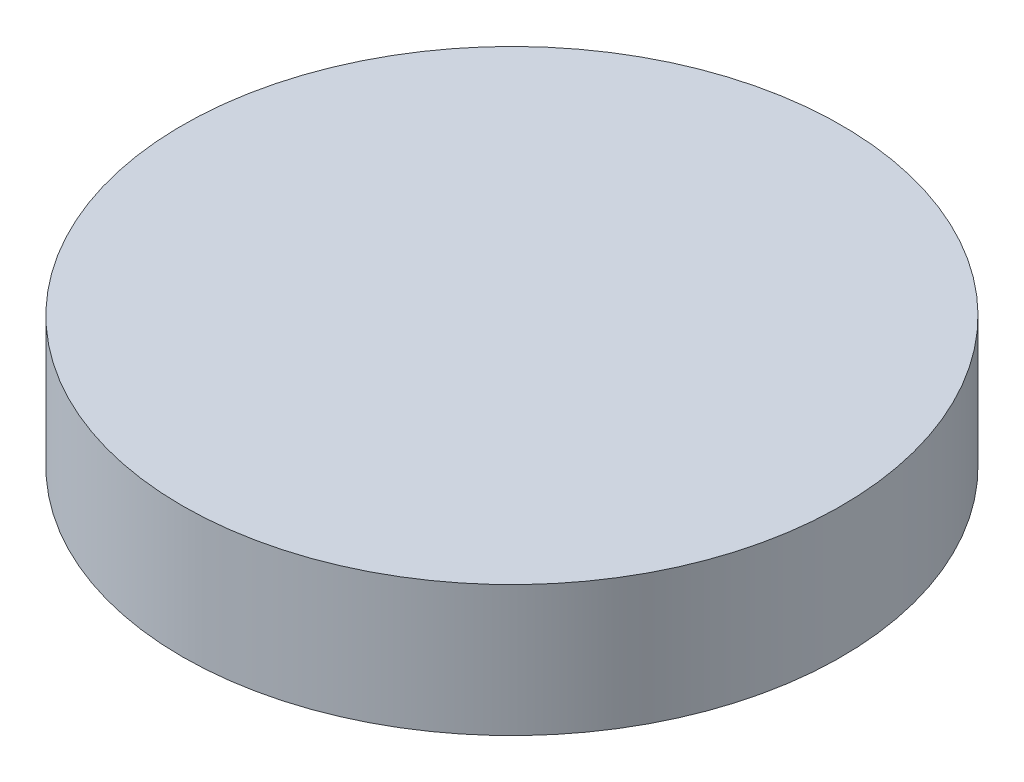
ISO-10303-21;
HEADER;
FILE_DESCRIPTION(('STEP AP214'),'2;1');
FILE_NAME('part.step','',(''),(''),'','','');
FILE_SCHEMA(('AUTOMOTIVE_DESIGN { 1 0 10303 214 1 1 1 1 }'));
ENDSEC;
DATA;
#1=APPLICATION_CONTEXT('core data for automotive mechanical design processes');
#2=APPLICATION_PROTOCOL_DEFINITION('international standard','automotive_design',2000,#1);
#3=PRODUCT_CONTEXT('',#1,'mechanical');
#4=PRODUCT('Part','Part','',(#3));
#5=PRODUCT_RELATED_PRODUCT_CATEGORY('part','',(#4));
#6=PRODUCT_DEFINITION_FORMATION('','',#4);
#7=PRODUCT_DEFINITION_CONTEXT('part definition',#1,'design');
#8=PRODUCT_DEFINITION('design','',#6,#7);
#9=PRODUCT_DEFINITION_SHAPE('','',#8);
#10=(LENGTH_UNIT() NAMED_UNIT(*) SI_UNIT(.MILLI.,.METRE.));
#11=(NAMED_UNIT(*) PLANE_ANGLE_UNIT() SI_UNIT($,.RADIAN.));
#12=(NAMED_UNIT(*) SI_UNIT($,.STERADIAN.) SOLID_ANGLE_UNIT());
#13=UNCERTAINTY_MEASURE_WITH_UNIT(LENGTH_MEASURE(1.E-05),#10,'distance_accuracy_value','');
#14=(GEOMETRIC_REPRESENTATION_CONTEXT(3) GLOBAL_UNCERTAINTY_ASSIGNED_CONTEXT((#13)) GLOBAL_UNIT_ASSIGNED_CONTEXT((#10,
#11,#12)) REPRESENTATION_CONTEXT('',''));
#15=CARTESIAN_POINT('',(0.,0.,0.));
#16=DIRECTION('',(0.,0.,1.));
#17=DIRECTION('',(1.,0.,0.));
#18=AXIS2_PLACEMENT_3D('',#15,#16,#17);
#19=CARTESIAN_POINT('',(0.,20.,0.));
#20=DIRECTION('',(0.,-1.,0.));
#21=DIRECTION('',(0.,0.,-1.));
#22=AXIS2_PLACEMENT_3D('',#19,#20,#21);
#23=CYLINDRICAL_SURFACE('',#22,60.);
#24=DIRECTION('',(0.,-1.,0.));
#25=VECTOR('',#24,1.);
#26=CARTESIAN_POINT('',(-24.473051543471,20.,54.7820203000091));
#27=LINE('',#26,#25);
#28=CARTESIAN_POINT('',(-24.473051543471,0.,54.7820203000091));
#29=VERTEX_POINT('',#28);
#30=CARTESIAN_POINT('',(-24.473051543471,20.,54.7820203000091));
#31=VERTEX_POINT('',#30);
#32=EDGE_CURVE('E495',#29,#31,#27,.F.);
#33=ORIENTED_EDGE('',*,*,#32,.F.);
#34=CARTESIAN_POINT('',(0.,0.,0.));
#35=DIRECTION('',(0.,-1.,0.));
#36=DIRECTION('',(0.,0.,-1.));
#37=AXIS2_PLACEMENT_3D('',#34,#35,#36);
#38=CIRCLE('',#37,60.);
#39=CARTESIAN_POINT('',(-54.4892769106156,0.,25.1180951060836));
#40=VERTEX_POINT('',#39);
#41=EDGE_CURVE('E530',#29,#40,#38,.T.);
#42=ORIENTED_EDGE('',*,*,#41,.T.);
#43=DIRECTION('',(0.,-1.,0.));
#44=VECTOR('',#43,1.);
#45=CARTESIAN_POINT('',(-54.4892769106155,20.,25.1180951060836));
#46=LINE('',#45,#44);
#47=CARTESIAN_POINT('',(-54.4892769106156,20.,25.1180951060836));
#48=VERTEX_POINT('',#47);
#49=EDGE_CURVE('E444',#48,#40,#46,.T.);
#50=ORIENTED_EDGE('',*,*,#49,.F.);
#51=CARTESIAN_POINT('',(0.,20.,0.));
#52=DIRECTION('',(0.,-1.,0.));
#53=DIRECTION('',(0.,0.,-1.));
#54=AXIS2_PLACEMENT_3D('',#51,#52,#53);
#55=CIRCLE('',#54,60.);
#56=EDGE_CURVE('E630',#31,#48,#55,.T.);
#57=ORIENTED_EDGE('',*,*,#56,.F.);
#58=EDGE_LOOP('',(#33,#42,#50,#57));
#59=FACE_BOUND('',#58,.T.);
#60=ADVANCED_FACE('F177',(#59),#23,.F.);
#61=DIRECTION('',(0.,-1.,0.));
#62=VECTOR('',#61,1.);
#63=CARTESIAN_POINT('',(20.7685618254475,20.,-56.2909125854482));
#64=LINE('',#63,#62);
#65=CARTESIAN_POINT('',(20.7685618254475,20.,-56.2909125854481));
#66=VERTEX_POINT('',#65);
#67=CARTESIAN_POINT('',(20.7685618254475,0.,-56.2909125854481));
#68=VERTEX_POINT('',#67);
#69=EDGE_CURVE('E484',#66,#68,#64,.T.);
#70=ORIENTED_EDGE('',*,*,#69,.F.);
#71=CARTESIAN_POINT('',(-23.2878275000444,20.,-55.2962665134652));
#72=VERTEX_POINT('',#71);
#73=EDGE_CURVE('E505',#72,#66,#55,.T.);
#74=ORIENTED_EDGE('',*,*,#73,.F.);
#75=DIRECTION('',(0.,-1.,0.));
#76=VECTOR('',#75,1.);
#77=CARTESIAN_POINT('',(-23.2878275000444,20.,-55.2962665134652));
#78=LINE('',#77,#76);
#79=CARTESIAN_POINT('',(-23.2878275000444,0.,-55.2962665134652));
#80=VERTEX_POINT('',#79);
#81=EDGE_CURVE('E192',#72,#80,#78,.T.);
#82=ORIENTED_EDGE('',*,*,#81,.T.);
#83=EDGE_CURVE('E511',#80,#68,#38,.T.);
#84=ORIENTED_EDGE('',*,*,#83,.T.);
#85=EDGE_LOOP('',(#70,#74,#82,#84));
#86=FACE_BOUND('',#85,.T.);
#87=ADVANCED_FACE('F591',(#86),#23,.F.);
#88=DIRECTION('',(0.,-1.,0.));
#89=VECTOR('',#88,1.);
#90=CARTESIAN_POINT('',(56.0417987439518,20.,-21.4316773385193));
#91=LINE('',#90,#89);
#92=CARTESIAN_POINT('',(56.0417987439518,0.,-21.4316773385193));
#93=VERTEX_POINT('',#92);
#94=CARTESIAN_POINT('',(56.0417987439518,20.,-21.4316773385193));
#95=VERTEX_POINT('',#94);
#96=EDGE_CURVE('E474',#93,#95,#91,.F.);
#97=ORIENTED_EDGE('',*,*,#96,.F.);
#98=CARTESIAN_POINT('',(55.5673457703538,0.,22.633384281586));
#99=VERTEX_POINT('',#98);
#100=EDGE_CURVE('E517',#93,#99,#38,.T.);
#101=ORIENTED_EDGE('',*,*,#100,.T.);
#102=DIRECTION('',(0.,-1.,0.));
#103=VECTOR('',#102,1.);
#104=CARTESIAN_POINT('',(55.5673457703538,20.,22.633384281586));
#105=LINE('',#104,#103);
#106=CARTESIAN_POINT('',(55.5673457703538,20.,22.6333842815859));
#107=VERTEX_POINT('',#106);
#108=EDGE_CURVE('E470',#99,#107,#105,.F.);
#109=ORIENTED_EDGE('',*,*,#108,.T.);
#110=EDGE_CURVE('E642',#95,#107,#55,.T.);
#111=ORIENTED_EDGE('',*,*,#110,.F.);
#112=EDGE_LOOP('',(#97,#101,#109,#111));
#113=FACE_BOUND('',#112,.T.);
#114=ADVANCED_FACE('F671',(#113),#23,.F.);
#115=DIRECTION('',(0.,-1.,0.));
#116=VECTOR('',#115,1.);
#117=CARTESIAN_POINT('',(54.7820203000091,20.,24.4730515434711));
#118=LINE('',#117,#116);
#119=CARTESIAN_POINT('',(54.7820203000091,0.,24.4730515434711));
#120=VERTEX_POINT('',#119);
#121=CARTESIAN_POINT('',(54.7820203000091,20.,24.4730515434711));
#122=VERTEX_POINT('',#121);
#123=EDGE_CURVE('E465',#120,#122,#118,.F.);
#124=ORIENTED_EDGE('',*,*,#123,.F.);
#125=CARTESIAN_POINT('',(23.2878275000444,0.,55.2962665134652));
#126=VERTEX_POINT('',#125);
#127=EDGE_CURVE('E520',#120,#126,#38,.T.);
#128=ORIENTED_EDGE('',*,*,#127,.T.);
#129=DIRECTION('',(0.,-1.,0.));
#130=VECTOR('',#129,1.);
#131=CARTESIAN_POINT('',(23.2878275000444,20.,55.2962665134652));
#132=LINE('',#131,#130);
#133=CARTESIAN_POINT('',(23.2878275000444,20.,55.2962665134652));
#134=VERTEX_POINT('',#133);
#135=EDGE_CURVE('E460',#126,#134,#132,.F.);
#136=ORIENTED_EDGE('',*,*,#135,.T.);
#137=EDGE_CURVE('E637',#122,#134,#55,.T.);
#138=ORIENTED_EDGE('',*,*,#137,.F.);
#139=EDGE_LOOP('',(#124,#128,#136,#138));
#140=FACE_BOUND('',#139,.T.);
#141=ADVANCED_FACE('F1005',(#140),#23,.F.);
#142=CARTESIAN_POINT('',(21.4316773385193,0.,56.0417987439518));
#143=VERTEX_POINT('',#142);
#144=CARTESIAN_POINT('',(-22.6333842815859,0.,55.5673457703538));
#145=VERTEX_POINT('',#144);
#146=EDGE_CURVE('E525',#143,#145,#38,.T.);
#147=ORIENTED_EDGE('',*,*,#146,.T.);
#148=DIRECTION('',(0.,-1.,0.));
#149=VECTOR('',#148,1.);
#150=CARTESIAN_POINT('',(-22.6333842815859,20.,55.5673457703538));
#151=LINE('',#150,#149);
#152=CARTESIAN_POINT('',(-22.6333842815859,20.,55.5673457703538));
#153=VERTEX_POINT('',#152);
#154=EDGE_CURVE('E489',#145,#153,#151,.F.);
#155=ORIENTED_EDGE('',*,*,#154,.T.);
#156=CARTESIAN_POINT('',(21.4316773385193,20.,56.0417987439518));
#157=VERTEX_POINT('',#156);
#158=EDGE_CURVE('E632',#157,#153,#55,.T.);
#159=ORIENTED_EDGE('',*,*,#158,.F.);
#160=DIRECTION('',(0.,-1.,0.));
#161=VECTOR('',#160,1.);
#162=CARTESIAN_POINT('',(21.4316773385193,20.,56.0417987439518));
#163=LINE('',#162,#161);
#164=EDGE_CURVE('E455',#143,#157,#163,.F.);
#165=ORIENTED_EDGE('',*,*,#164,.F.);
#166=EDGE_LOOP('',(#147,#155,#159,#165));
#167=FACE_BOUND('',#166,.T.);
#168=ADVANCED_FACE('F997',(#167),#23,.F.);
#169=CARTESIAN_POINT('',(22.6333842815859,20.,-55.5673457703538));
#170=VERTEX_POINT('',#169);
#171=CARTESIAN_POINT('',(55.2962665134652,20.,-23.2878275000445));
#172=VERTEX_POINT('',#171);
#173=EDGE_CURVE('E510',#170,#172,#55,.T.);
#174=ORIENTED_EDGE('',*,*,#173,.F.);
#175=DIRECTION('',(0.,-1.,0.));
#176=VECTOR('',#175,1.);
#177=CARTESIAN_POINT('',(22.6333842815859,20.,-55.5673457703538));
#178=LINE('',#177,#176);
#179=CARTESIAN_POINT('',(22.6333842815859,0.,-55.5673457703538));
#180=VERTEX_POINT('',#179);
#181=EDGE_CURVE('E479',#170,#180,#178,.T.);
#182=ORIENTED_EDGE('',*,*,#181,.T.);
#183=CARTESIAN_POINT('',(55.2962665134652,0.,-23.2878275000445));
#184=VERTEX_POINT('',#183);
#185=EDGE_CURVE('E509',#180,#184,#38,.T.);
#186=ORIENTED_EDGE('',*,*,#185,.T.);
#187=DIRECTION('',(0.,-1.,0.));
#188=VECTOR('',#187,1.);
#189=CARTESIAN_POINT('',(55.2962665134652,20.,-23.2878275000445));
#190=LINE('',#189,#188);
#191=EDGE_CURVE('E449',#184,#172,#190,.F.);
#192=ORIENTED_EDGE('',*,*,#191,.T.);
#193=EDGE_LOOP('',(#174,#182,#186,#192));
#194=FACE_BOUND('',#193,.T.);
#195=ADVANCED_FACE('F765',(#194),#23,.F.);
#196=CARTESIAN_POINT('',(-55.5673457703538,20.,-22.6333842815859));
#197=VERTEX_POINT('',#196);
#198=CARTESIAN_POINT('',(-25.1180951060836,20.,-54.4892769106155));
#199=VERTEX_POINT('',#198);
#200=EDGE_CURVE('E508',#197,#199,#55,.T.);
#201=ORIENTED_EDGE('',*,*,#200,.F.);
#202=DIRECTION('',(0.,-1.,0.));
#203=VECTOR('',#202,1.);
#204=CARTESIAN_POINT('',(-55.5673457703538,20.,-22.6333842815859));
#205=LINE('',#204,#203);
#206=CARTESIAN_POINT('',(-55.5673457703538,0.,-22.6333842815859));
#207=VERTEX_POINT('',#206);
#208=EDGE_CURVE('E433',#197,#207,#205,.T.);
#209=ORIENTED_EDGE('',*,*,#208,.T.);
#210=CARTESIAN_POINT('',(-25.1180951060836,0.,-54.4892769106155));
#211=VERTEX_POINT('',#210);
#212=EDGE_CURVE('E200',#207,#211,#38,.T.);
#213=ORIENTED_EDGE('',*,*,#212,.T.);
#214=DIRECTION('',(0.,-1.,0.));
#215=VECTOR('',#214,1.);
#216=CARTESIAN_POINT('',(-25.1180951060836,20.,-54.4892769106155));
#217=LINE('',#216,#215);
#218=EDGE_CURVE('E429',#199,#211,#217,.T.);
#219=ORIENTED_EDGE('',*,*,#218,.F.);
#220=EDGE_LOOP('',(#201,#209,#213,#219));
#221=FACE_BOUND('',#220,.T.);
#222=ADVANCED_FACE('F624',(#221),#23,.F.);
#223=CARTESIAN_POINT('',(0.,20.,0.));
#224=DIRECTION('',(0.,-1.,0.));
#225=DIRECTION('',(0.,0.,-1.));
#226=AXIS2_PLACEMENT_3D('',#223,#224,#225);
#227=PLANE('',#226);
#228=CARTESIAN_POINT('',(0.,20.,0.));
#229=DIRECTION('',(0.,-1.,0.));
#230=DIRECTION('',(0.,0.,-1.));
#231=AXIS2_PLACEMENT_3D('',#228,#229,#230);
#232=CIRCLE('',#231,7.5);
#233=CARTESIAN_POINT('',(-4.57897019920072,20.,5.93995218119066));
#234=VERTEX_POINT('',#233);
#235=CARTESIAN_POINT('',(-5.88547951261343,20.,4.64877735610213));
#236=VERTEX_POINT('',#235);
#237=EDGE_CURVE('E398',#234,#236,#232,.T.);
#238=ORIENTED_EDGE('',*,*,#237,.F.);
#239=DIRECTION('',(0.377223071359765,0.,-0.926122429505897));
#240=VECTOR('',#239,1.);
#241=CARTESIAN_POINT('',(-25.1255335409904,20.,56.3839324274229));
#242=LINE('',#241,#240);
#243=EDGE_CURVE('E578',#31,#234,#242,.T.);
#244=ORIENTED_EDGE('',*,*,#243,.F.);
#245=ORIENTED_EDGE('',*,*,#56,.T.);
#246=DIRECTION('',(-0.921604441891087,0.,0.388130458334074));
#247=VECTOR('',#246,1.);
#248=CARTESIAN_POINT('',(57.6358961171592,20.,-22.1030258216305));
#249=LINE('',#248,#247);
#250=EDGE_CURVE('E559',#236,#48,#249,.T.);
#251=ORIENTED_EDGE('',*,*,#250,.F.);
#252=EDGE_LOOP('',(#238,#244,#245,#251));
#253=FACE_BOUND('',#252,.T.);
#254=ADVANCED_FACE('F675',(#253),#227,.T.);
#255=ORIENTED_EDGE('',*,*,#73,.T.);
#256=CARTESIAN_POINT('',(0.874480481177144,20.,-7.44884446662972));
#257=VERTEX_POINT('',#256);
#258=EDGE_CURVE('E569',#257,#66,#242,.T.);
#259=ORIENTED_EDGE('',*,*,#258,.F.);
#260=CARTESIAN_POINT('',(-2.91097843750553,20.,-6.91203331418316));
#261=VERTEX_POINT('',#260);
#262=EDGE_CURVE('E497',#261,#257,#232,.T.);
#263=ORIENTED_EDGE('',*,*,#262,.F.);
#264=DIRECTION('',(-0.388130458334073,0.,-0.921604441891087));
#265=VECTOR('',#264,1.);
#266=CARTESIAN_POINT('',(23.9462347054127,20.,56.859635200491));
#267=LINE('',#266,#265);
#268=EDGE_CURVE('E594',#261,#72,#267,.T.);
#269=ORIENTED_EDGE('',*,*,#268,.T.);
#270=EDGE_LOOP('',(#255,#259,#263,#269));
#271=FACE_BOUND('',#270,.T.);
#272=ADVANCED_FACE('F592',(#271),#227,.T.);
#273=CARTESIAN_POINT('',(7.43800134594967,20.,-0.962359588537822));
#274=VERTEX_POINT('',#273);
#275=CARTESIAN_POINT('',(6.94591822129422,20.,2.82917303519825));
#276=VERTEX_POINT('',#275);
#277=EDGE_CURVE('E732',#274,#276,#232,.T.);
#278=ORIENTED_EDGE('',*,*,#277,.F.);
#279=EDGE_CURVE('E570',#95,#274,#249,.T.);
#280=ORIENTED_EDGE('',*,*,#279,.F.);
#281=ORIENTED_EDGE('',*,*,#110,.T.);
#282=DIRECTION('',(-0.926122429505897,0.,-0.377223071359766));
#283=VECTOR('',#282,1.);
#284=CARTESIAN_POINT('',(57.1383785701424,20.,23.2732886819787));
#285=LINE('',#284,#283);
#286=EDGE_CURVE('E547',#107,#276,#285,.T.);
#287=ORIENTED_EDGE('',*,*,#286,.T.);
#288=EDGE_LOOP('',(#278,#280,#281,#287));
#289=FACE_BOUND('',#288,.T.);
#290=ADVANCED_FACE('F755',(#289),#227,.T.);
#291=CARTESIAN_POINT('',(5.93995218119065,20.,4.57897019920074));
#292=VERTEX_POINT('',#291);
#293=CARTESIAN_POINT('',(2.91097843750557,20.,6.91203331418315));
#294=VERTEX_POINT('',#293);
#295=EDGE_CURVE('E730',#292,#294,#232,.T.);
#296=ORIENTED_EDGE('',*,*,#295,.F.);
#297=DIRECTION('',(-0.926122429505897,0.,-0.377223071359766));
#298=VECTOR('',#297,1.);
#299=CARTESIAN_POINT('',(56.3839324274229,20.,25.1255335409904));
#300=LINE('',#299,#298);
#301=EDGE_CURVE('E409',#122,#292,#300,.T.);
#302=ORIENTED_EDGE('',*,*,#301,.F.);
#303=ORIENTED_EDGE('',*,*,#137,.T.);
#304=EDGE_CURVE('E555',#134,#294,#267,.T.);
#305=ORIENTED_EDGE('',*,*,#304,.T.);
#306=EDGE_LOOP('',(#296,#302,#303,#305));
#307=FACE_BOUND('',#306,.T.);
#308=ADVANCED_FACE('F954',(#307),#227,.T.);
#309=DIRECTION('',(0.377223071359766,0.,-0.926122429505897));
#310=VECTOR('',#309,1.);
#311=CARTESIAN_POINT('',(-23.2732886819786,20.,57.1383785701424));
#312=LINE('',#311,#310);
#313=CARTESIAN_POINT('',(-2.82917303519823,20.,6.94591822129423));
#314=VERTEX_POINT('',#313);
#315=EDGE_CURVE('E424',#153,#314,#312,.T.);
#316=ORIENTED_EDGE('',*,*,#315,.T.);
#317=CARTESIAN_POINT('',(0.962359588537813,20.,7.43800134594968));
#318=VERTEX_POINT('',#317);
#319=EDGE_CURVE('E727',#318,#314,#232,.T.);
#320=ORIENTED_EDGE('',*,*,#319,.F.);
#321=DIRECTION('',(-0.388130458334073,0.,-0.921604441891087));
#322=VECTOR('',#321,1.);
#323=CARTESIAN_POINT('',(22.1030258216305,20.,57.6358961171592));
#324=LINE('',#323,#322);
#325=EDGE_CURVE('E597',#157,#318,#324,.T.);
#326=ORIENTED_EDGE('',*,*,#325,.F.);
#327=ORIENTED_EDGE('',*,*,#158,.T.);
#328=EDGE_LOOP('',(#316,#320,#326,#327));
#329=FACE_BOUND('',#328,.T.);
#330=ADVANCED_FACE('F726',(#329),#227,.T.);
#331=CARTESIAN_POINT('',(2.82917303519825,20.,-6.94591822129422));
#332=VERTEX_POINT('',#331);
#333=EDGE_CURVE('E579',#332,#170,#312,.T.);
#334=ORIENTED_EDGE('',*,*,#333,.T.);
#335=ORIENTED_EDGE('',*,*,#173,.T.);
#336=DIRECTION('',(-0.921604441891087,0.,0.388130458334074));
#337=VECTOR('',#336,1.);
#338=CARTESIAN_POINT('',(56.859635200491,20.,-23.9462347054127));
#339=LINE('',#338,#337);
#340=CARTESIAN_POINT('',(6.91203331418314,20.,-2.91097843750559));
#341=VERTEX_POINT('',#340);
#342=EDGE_CURVE('E573',#172,#341,#339,.T.);
#343=ORIENTED_EDGE('',*,*,#342,.T.);
#344=EDGE_CURVE('E501',#332,#341,#232,.T.);
#345=ORIENTED_EDGE('',*,*,#344,.F.);
#346=EDGE_LOOP('',(#334,#335,#343,#345));
#347=FACE_BOUND('',#346,.T.);
#348=ADVANCED_FACE('F763',(#347),#227,.T.);
#349=CARTESIAN_POINT('',(-6.94591822129423,20.,-2.82917303519823));
#350=VERTEX_POINT('',#349);
#351=EDGE_CURVE('E551',#350,#197,#285,.T.);
#352=ORIENTED_EDGE('',*,*,#351,.T.);
#353=ORIENTED_EDGE('',*,*,#200,.T.);
#354=CARTESIAN_POINT('',(-4.64877735610213,20.,-5.88547951261343));
#355=VERTEX_POINT('',#354);
#356=EDGE_CURVE('E600',#355,#199,#324,.T.);
#357=ORIENTED_EDGE('',*,*,#356,.F.);
#358=EDGE_CURVE('E399',#350,#355,#232,.T.);
#359=ORIENTED_EDGE('',*,*,#358,.F.);
#360=EDGE_LOOP('',(#352,#353,#357,#359));
#361=FACE_BOUND('',#360,.T.);
#362=ADVANCED_FACE('F627',(#361),#227,.T.);
#363=CARTESIAN_POINT('',(0.,0.,0.));
#364=DIRECTION('',(0.,1.,0.));
#365=DIRECTION('',(0.,0.,1.));
#366=AXIS2_PLACEMENT_3D('',#363,#364,#365);
#367=CYLINDRICAL_SURFACE('',#366,7.5);
#368=DIRECTION('',(0.,1.,0.));
#369=VECTOR('',#368,1.);
#370=CARTESIAN_POINT('',(-4.57897019920073,0.,5.93995218119066));
#371=LINE('',#370,#369);
#372=CARTESIAN_POINT('',(-4.57897019920073,0.,5.93995218119066));
#373=VERTEX_POINT('',#372);
#374=EDGE_CURVE('E492',#234,#373,#371,.F.);
#375=ORIENTED_EDGE('',*,*,#374,.F.);
#376=ORIENTED_EDGE('',*,*,#237,.T.);
#377=DIRECTION('',(0.,1.,0.));
#378=VECTOR('',#377,1.);
#379=CARTESIAN_POINT('',(-5.88547951261341,0.,4.64877735610212));
#380=LINE('',#379,#378);
#381=CARTESIAN_POINT('',(-5.88547951261343,0.,4.64877735610213));
#382=VERTEX_POINT('',#381);
#383=EDGE_CURVE('E442',#382,#236,#380,.T.);
#384=ORIENTED_EDGE('',*,*,#383,.F.);
#385=CARTESIAN_POINT('',(0.,0.,0.));
#386=DIRECTION('',(0.,-1.,0.));
#387=DIRECTION('',(0.,0.,-1.));
#388=AXIS2_PLACEMENT_3D('',#385,#386,#387);
#389=CIRCLE('',#388,7.5);
#390=EDGE_CURVE('E741',#373,#382,#389,.T.);
#391=ORIENTED_EDGE('',*,*,#390,.F.);
#392=EDGE_LOOP('',(#375,#376,#384,#391));
#393=FACE_BOUND('',#392,.T.);
#394=ADVANCED_FACE('F679',(#393),#367,.T.);
#395=DIRECTION('',(0.,1.,0.));
#396=VECTOR('',#395,1.);
#397=CARTESIAN_POINT('',(0.87448048117714,0.,-7.44884446662972));
#398=LINE('',#397,#396);
#399=CARTESIAN_POINT('',(0.87448048117714,0.,-7.44884446662972));
#400=VERTEX_POINT('',#399);
#401=EDGE_CURVE('E482',#400,#257,#398,.T.);
#402=ORIENTED_EDGE('',*,*,#401,.F.);
#403=CARTESIAN_POINT('',(-2.91097843750555,0.,-6.91203331418315));
#404=VERTEX_POINT('',#403);
#405=EDGE_CURVE('E498',#404,#400,#389,.T.);
#406=ORIENTED_EDGE('',*,*,#405,.F.);
#407=DIRECTION('',(0.,1.,0.));
#408=VECTOR('',#407,1.);
#409=CARTESIAN_POINT('',(-2.91097843750553,0.,-6.91203331418316));
#410=LINE('',#409,#408);
#411=EDGE_CURVE('E439',#404,#261,#410,.T.);
#412=ORIENTED_EDGE('',*,*,#411,.T.);
#413=ORIENTED_EDGE('',*,*,#262,.T.);
#414=EDGE_LOOP('',(#402,#406,#412,#413));
#415=FACE_BOUND('',#414,.T.);
#416=ADVANCED_FACE('F917',(#415),#367,.T.);
#417=DIRECTION('',(0.,1.,0.));
#418=VECTOR('',#417,1.);
#419=CARTESIAN_POINT('',(7.43800134594968,0.,-0.962359588537829));
#420=LINE('',#419,#418);
#421=CARTESIAN_POINT('',(7.43800134594967,0.,-0.962359588537822));
#422=VERTEX_POINT('',#421);
#423=EDGE_CURVE('E472',#274,#422,#420,.F.);
#424=ORIENTED_EDGE('',*,*,#423,.F.);
#425=ORIENTED_EDGE('',*,*,#277,.T.);
#426=DIRECTION('',(0.,1.,0.));
#427=VECTOR('',#426,1.);
#428=CARTESIAN_POINT('',(6.94591822129422,0.,2.82917303519825));
#429=LINE('',#428,#427);
#430=CARTESIAN_POINT('',(6.94591822129423,0.,2.82917303519824));
#431=VERTEX_POINT('',#430);
#432=EDGE_CURVE('E468',#276,#431,#429,.F.);
#433=ORIENTED_EDGE('',*,*,#432,.T.);
#434=EDGE_CURVE('E515',#422,#431,#389,.T.);
#435=ORIENTED_EDGE('',*,*,#434,.F.);
#436=EDGE_LOOP('',(#424,#425,#433,#435));
#437=FACE_BOUND('',#436,.T.);
#438=ADVANCED_FACE('F908',(#437),#367,.T.);
#439=DIRECTION('',(0.,1.,0.));
#440=VECTOR('',#439,1.);
#441=CARTESIAN_POINT('',(5.93995218119065,0.,4.57897019920074));
#442=LINE('',#441,#440);
#443=CARTESIAN_POINT('',(5.93995218119065,0.,4.57897019920074));
#444=VERTEX_POINT('',#443);
#445=EDGE_CURVE('E462',#292,#444,#442,.F.);
#446=ORIENTED_EDGE('',*,*,#445,.F.);
#447=ORIENTED_EDGE('',*,*,#295,.T.);
#448=DIRECTION('',(0.,1.,0.));
#449=VECTOR('',#448,1.);
#450=CARTESIAN_POINT('',(2.91097843750557,0.,6.91203331418315));
#451=LINE('',#450,#449);
#452=CARTESIAN_POINT('',(2.91097843750555,0.,6.91203331418315));
#453=VERTEX_POINT('',#452);
#454=EDGE_CURVE('E458',#294,#453,#451,.F.);
#455=ORIENTED_EDGE('',*,*,#454,.T.);
#456=EDGE_CURVE('E743',#444,#453,#389,.T.);
#457=ORIENTED_EDGE('',*,*,#456,.F.);
#458=EDGE_LOOP('',(#446,#447,#455,#457));
#459=FACE_BOUND('',#458,.T.);
#460=ADVANCED_FACE('F900',(#459),#367,.T.);
#461=ORIENTED_EDGE('',*,*,#319,.T.);
#462=DIRECTION('',(0.,1.,0.));
#463=VECTOR('',#462,1.);
#464=CARTESIAN_POINT('',(-2.82917303519823,0.,6.94591822129423));
#465=LINE('',#464,#463);
#466=CARTESIAN_POINT('',(-2.82917303519823,0.,6.94591822129423));
#467=VERTEX_POINT('',#466);
#468=EDGE_CURVE('E486',#314,#467,#465,.F.);
#469=ORIENTED_EDGE('',*,*,#468,.T.);
#470=CARTESIAN_POINT('',(0.962359588537808,0.,7.43800134594968));
#471=VERTEX_POINT('',#470);
#472=EDGE_CURVE('E742',#471,#467,#389,.T.);
#473=ORIENTED_EDGE('',*,*,#472,.F.);
#474=DIRECTION('',(0.,1.,0.));
#475=VECTOR('',#474,1.);
#476=CARTESIAN_POINT('',(0.962359588537813,0.,7.43800134594969));
#477=LINE('',#476,#475);
#478=EDGE_CURVE('E452',#318,#471,#477,.F.);
#479=ORIENTED_EDGE('',*,*,#478,.F.);
#480=EDGE_LOOP('',(#461,#469,#473,#479));
#481=FACE_BOUND('',#480,.T.);
#482=ADVANCED_FACE('F729',(#481),#367,.T.);
#483=CARTESIAN_POINT('',(2.82917303519824,0.,-6.94591822129423));
#484=VERTEX_POINT('',#483);
#485=CARTESIAN_POINT('',(6.91203331418315,0.,-2.91097843750555));
#486=VERTEX_POINT('',#485);
#487=EDGE_CURVE('E502',#484,#486,#389,.T.);
#488=ORIENTED_EDGE('',*,*,#487,.F.);
#489=DIRECTION('',(0.,1.,0.));
#490=VECTOR('',#489,1.);
#491=CARTESIAN_POINT('',(2.82917303519825,0.,-6.94591822129422));
#492=LINE('',#491,#490);
#493=EDGE_CURVE('E476',#484,#332,#492,.T.);
#494=ORIENTED_EDGE('',*,*,#493,.T.);
#495=ORIENTED_EDGE('',*,*,#344,.T.);
#496=DIRECTION('',(0.,1.,0.));
#497=VECTOR('',#496,1.);
#498=CARTESIAN_POINT('',(6.91203331418314,0.,-2.91097843750559));
#499=LINE('',#498,#497);
#500=EDGE_CURVE('E446',#341,#486,#499,.F.);
#501=ORIENTED_EDGE('',*,*,#500,.T.);
#502=EDGE_LOOP('',(#488,#494,#495,#501));
#503=FACE_BOUND('',#502,.T.);
#504=ADVANCED_FACE('F761',(#503),#367,.T.);
#505=CARTESIAN_POINT('',(-6.94591822129423,0.,-2.82917303519824));
#506=VERTEX_POINT('',#505);
#507=CARTESIAN_POINT('',(-4.64877735610212,0.,-5.88547951261341));
#508=VERTEX_POINT('',#507);
#509=EDGE_CURVE('E500',#506,#508,#389,.T.);
#510=ORIENTED_EDGE('',*,*,#509,.F.);
#511=DIRECTION('',(0.,1.,0.));
#512=VECTOR('',#511,1.);
#513=CARTESIAN_POINT('',(-6.94591822129423,0.,-2.82917303519823));
#514=LINE('',#513,#512);
#515=EDGE_CURVE('E431',#506,#350,#514,.T.);
#516=ORIENTED_EDGE('',*,*,#515,.T.);
#517=ORIENTED_EDGE('',*,*,#358,.T.);
#518=DIRECTION('',(0.,1.,0.));
#519=VECTOR('',#518,1.);
#520=CARTESIAN_POINT('',(-4.64877735610212,0.,-5.88547951261341));
#521=LINE('',#520,#519);
#522=EDGE_CURVE('E419',#508,#355,#521,.T.);
#523=ORIENTED_EDGE('',*,*,#522,.F.);
#524=EDGE_LOOP('',(#510,#516,#517,#523));
#525=FACE_BOUND('',#524,.T.);
#526=ADVANCED_FACE('F680',(#525),#367,.T.);
#527=CARTESIAN_POINT('',(0.,25.,0.));
#528=DIRECTION('',(0.,-1.,0.));
#529=DIRECTION('',(0.,0.,-1.));
#530=AXIS2_PLACEMENT_3D('',#527,#528,#529);
#531=CYLINDRICAL_SURFACE('',#530,63.);
#532=CARTESIAN_POINT('',(0.,25.,0.));
#533=DIRECTION('',(0.,1.,0.));
#534=DIRECTION('',(0.,0.,1.));
#535=AXIS2_PLACEMENT_3D('',#532,#533,#534);
#536=CIRCLE('',#535,63.);
#537=CARTESIAN_POINT('',(0.,25.,63.));
#538=VERTEX_POINT('',#537);
#539=EDGE_CURVE('E12',#538,#538,#536,.T.);
#540=ORIENTED_EDGE('',*,*,#539,.F.);
#541=EDGE_LOOP('',(#540));
#542=FACE_BOUND('',#541,.T.);
#543=CARTESIAN_POINT('',(0.,0.,0.));
#544=DIRECTION('',(0.,1.,0.));
#545=DIRECTION('',(0.,0.,1.));
#546=AXIS2_PLACEMENT_3D('',#543,#544,#545);
#547=CIRCLE('',#546,63.);
#548=CARTESIAN_POINT('',(0.,0.,63.));
#549=VERTEX_POINT('',#548);
#550=EDGE_CURVE('E181',#549,#549,#547,.T.);
#551=ORIENTED_EDGE('',*,*,#550,.T.);
#552=EDGE_LOOP('',(#551));
#553=FACE_BOUND('',#552,.T.);
#554=ADVANCED_FACE('F179',(#542,#553),#531,.T.);
#555=CARTESIAN_POINT('',(0.,25.,0.));
#556=DIRECTION('',(0.,1.,0.));
#557=DIRECTION('',(0.,0.,1.));
#558=AXIS2_PLACEMENT_3D('',#555,#556,#557);
#559=PLANE('',#558);
#560=ORIENTED_EDGE('',*,*,#539,.T.);
#561=EDGE_LOOP('',(#560));
#562=FACE_BOUND('',#561,.T.);
#563=ADVANCED_FACE('F658',(#562),#559,.T.);
#564=CARTESIAN_POINT('',(0.,0.,0.));
#565=DIRECTION('',(0.,1.,0.));
#566=DIRECTION('',(0.,0.,1.));
#567=AXIS2_PLACEMENT_3D('',#564,#565,#566);
#568=PLANE('',#567);
#569=ORIENTED_EDGE('',*,*,#41,.F.);
#570=DIRECTION('',(0.377223071359765,0.,-0.926122429505897));
#571=VECTOR('',#570,1.);
#572=CARTESIAN_POINT('',(-25.1255335409904,0.,56.3839324274229));
#573=LINE('',#572,#571);
#574=EDGE_CURVE('E576',#29,#373,#573,.T.);
#575=ORIENTED_EDGE('',*,*,#574,.T.);
#576=ORIENTED_EDGE('',*,*,#390,.T.);
#577=DIRECTION('',(-0.921604441891087,0.,0.388130458334074));
#578=VECTOR('',#577,1.);
#579=CARTESIAN_POINT('',(57.6358961171592,0.,-22.1030258216305));
#580=LINE('',#579,#578);
#581=EDGE_CURVE('E566',#382,#40,#580,.T.);
#582=ORIENTED_EDGE('',*,*,#581,.T.);
#583=EDGE_LOOP('',(#569,#575,#576,#582));
#584=FACE_BOUND('',#583,.T.);
#585=DIRECTION('',(0.377223071359766,0.,-0.926122429505897));
#586=VECTOR('',#585,1.);
#587=CARTESIAN_POINT('',(-23.2732886819786,0.,57.1383785701424));
#588=LINE('',#587,#586);
#589=EDGE_CURVE('E417',#145,#467,#588,.T.);
#590=ORIENTED_EDGE('',*,*,#589,.F.);
#591=ORIENTED_EDGE('',*,*,#146,.F.);
#592=DIRECTION('',(-0.388130458334073,0.,-0.921604441891087));
#593=VECTOR('',#592,1.);
#594=CARTESIAN_POINT('',(22.1030258216305,0.,57.6358961171592));
#595=LINE('',#594,#593);
#596=EDGE_CURVE('E607',#143,#471,#595,.T.);
#597=ORIENTED_EDGE('',*,*,#596,.T.);
#598=ORIENTED_EDGE('',*,*,#472,.T.);
#599=EDGE_LOOP('',(#590,#591,#597,#598));
#600=FACE_BOUND('',#599,.T.);
#601=EDGE_CURVE('E577',#400,#68,#573,.T.);
#602=ORIENTED_EDGE('',*,*,#601,.T.);
#603=ORIENTED_EDGE('',*,*,#83,.F.);
#604=DIRECTION('',(-0.388130458334073,0.,-0.921604441891087));
#605=VECTOR('',#604,1.);
#606=CARTESIAN_POINT('',(23.9462347054127,0.,56.859635200491));
#607=LINE('',#606,#605);
#608=EDGE_CURVE('E606',#404,#80,#607,.T.);
#609=ORIENTED_EDGE('',*,*,#608,.F.);
#610=ORIENTED_EDGE('',*,*,#405,.T.);
#611=EDGE_LOOP('',(#602,#603,#609,#610));
#612=FACE_BOUND('',#611,.T.);
#613=ORIENTED_EDGE('',*,*,#100,.F.);
#614=EDGE_CURVE('E562',#93,#422,#580,.T.);
#615=ORIENTED_EDGE('',*,*,#614,.T.);
#616=ORIENTED_EDGE('',*,*,#434,.T.);
#617=DIRECTION('',(-0.926122429505897,0.,-0.377223071359766));
#618=VECTOR('',#617,1.);
#619=CARTESIAN_POINT('',(57.1383785701424,0.,23.2732886819787));
#620=LINE('',#619,#618);
#621=EDGE_CURVE('E557',#99,#431,#620,.T.);
#622=ORIENTED_EDGE('',*,*,#621,.F.);
#623=EDGE_LOOP('',(#613,#615,#616,#622));
#624=FACE_BOUND('',#623,.T.);
#625=ORIENTED_EDGE('',*,*,#127,.F.);
#626=DIRECTION('',(-0.926122429505897,0.,-0.377223071359766));
#627=VECTOR('',#626,1.);
#628=CARTESIAN_POINT('',(56.3839324274229,0.,25.1255335409904));
#629=LINE('',#628,#627);
#630=EDGE_CURVE('E546',#120,#444,#629,.T.);
#631=ORIENTED_EDGE('',*,*,#630,.T.);
#632=ORIENTED_EDGE('',*,*,#456,.T.);
#633=EDGE_CURVE('E410',#126,#453,#607,.T.);
#634=ORIENTED_EDGE('',*,*,#633,.F.);
#635=EDGE_LOOP('',(#625,#631,#632,#634));
#636=FACE_BOUND('',#635,.T.);
#637=DIRECTION('',(-0.921604441891087,0.,0.388130458334074));
#638=VECTOR('',#637,1.);
#639=CARTESIAN_POINT('',(56.859635200491,0.,-23.9462347054127));
#640=LINE('',#639,#638);
#641=EDGE_CURVE('E567',#184,#486,#640,.T.);
#642=ORIENTED_EDGE('',*,*,#641,.F.);
#643=ORIENTED_EDGE('',*,*,#185,.F.);
#644=EDGE_CURVE('E421',#484,#180,#588,.T.);
#645=ORIENTED_EDGE('',*,*,#644,.F.);
#646=ORIENTED_EDGE('',*,*,#487,.T.);
#647=EDGE_LOOP('',(#642,#643,#645,#646));
#648=FACE_BOUND('',#647,.T.);
#649=EDGE_CURVE('E598',#508,#211,#595,.T.);
#650=ORIENTED_EDGE('',*,*,#649,.T.);
#651=ORIENTED_EDGE('',*,*,#212,.F.);
#652=EDGE_CURVE('E550',#506,#207,#620,.T.);
#653=ORIENTED_EDGE('',*,*,#652,.F.);
#654=ORIENTED_EDGE('',*,*,#509,.T.);
#655=EDGE_LOOP('',(#650,#651,#653,#654));
#656=FACE_BOUND('',#655,.T.);
#657=CARTESIAN_POINT('',(-55.2962665134652,0.,23.2878275000444));
#658=VERTEX_POINT('',#657);
#659=CARTESIAN_POINT('',(-56.2909125854482,0.,-20.7685618254475));
#660=VERTEX_POINT('',#659);
#661=EDGE_CURVE('E513',#658,#660,#38,.T.);
#662=ORIENTED_EDGE('',*,*,#661,.F.);
#663=CARTESIAN_POINT('',(-6.91203331418317,0.,2.91097843750553));
#664=VERTEX_POINT('',#663);
#665=EDGE_CURVE('E565',#664,#658,#640,.T.);
#666=ORIENTED_EDGE('',*,*,#665,.F.);
#667=CARTESIAN_POINT('',(-7.44884446662972,0.,-0.874480481177124));
#668=VERTEX_POINT('',#667);
#669=EDGE_CURVE('E545',#664,#668,#389,.T.);
#670=ORIENTED_EDGE('',*,*,#669,.T.);
#671=EDGE_CURVE('E415',#668,#660,#629,.T.);
#672=ORIENTED_EDGE('',*,*,#671,.T.);
#673=EDGE_LOOP('',(#662,#666,#670,#672));
#674=FACE_BOUND('',#673,.T.);
#675=ORIENTED_EDGE('',*,*,#550,.F.);
#676=EDGE_LOOP('',(#675));
#677=FACE_BOUND('',#676,.T.);
#678=ADVANCED_FACE('F543',(#584,#600,#612,#624,#636,#648,#656,#674,#677),#568,.F.);
#679=CARTESIAN_POINT('',(-55.2962665134652,20.,23.2878275000444));
#680=VERTEX_POINT('',#679);
#681=CARTESIAN_POINT('',(-56.2909125854482,20.,-20.7685618254475));
#682=VERTEX_POINT('',#681);
#683=EDGE_CURVE('E406',#680,#682,#55,.T.);
#684=ORIENTED_EDGE('',*,*,#683,.F.);
#685=DIRECTION('',(0.,-1.,0.));
#686=VECTOR('',#685,1.);
#687=CARTESIAN_POINT('',(-55.2962665134652,20.,23.2878275000444));
#688=LINE('',#687,#686);
#689=EDGE_CURVE('E436',#680,#658,#688,.T.);
#690=ORIENTED_EDGE('',*,*,#689,.T.);
#691=ORIENTED_EDGE('',*,*,#661,.T.);
#692=DIRECTION('',(0.,-1.,0.));
#693=VECTOR('',#692,1.);
#694=CARTESIAN_POINT('',(-56.2909125854482,20.,-20.7685618254475));
#695=LINE('',#694,#693);
#696=EDGE_CURVE('E416',#682,#660,#695,.T.);
#697=ORIENTED_EDGE('',*,*,#696,.F.);
#698=EDGE_LOOP('',(#684,#690,#691,#697));
#699=FACE_BOUND('',#698,.T.);
#700=ADVANCED_FACE('F540',(#699),#23,.F.);
#701=CARTESIAN_POINT('',(-6.91203331418316,20.,2.91097843750552));
#702=VERTEX_POINT('',#701);
#703=EDGE_CURVE('E572',#702,#680,#339,.T.);
#704=ORIENTED_EDGE('',*,*,#703,.T.);
#705=ORIENTED_EDGE('',*,*,#683,.T.);
#706=CARTESIAN_POINT('',(-7.44884446662972,20.,-0.874480481177126));
#707=VERTEX_POINT('',#706);
#708=EDGE_CURVE('E403',#707,#682,#300,.T.);
#709=ORIENTED_EDGE('',*,*,#708,.F.);
#710=EDGE_CURVE('E388',#702,#707,#232,.T.);
#711=ORIENTED_EDGE('',*,*,#710,.F.);
#712=EDGE_LOOP('',(#704,#705,#709,#711));
#713=FACE_BOUND('',#712,.T.);
#714=ADVANCED_FACE('F404',(#713),#227,.T.);
#715=ORIENTED_EDGE('',*,*,#669,.F.);
#716=DIRECTION('',(0.,1.,0.));
#717=VECTOR('',#716,1.);
#718=CARTESIAN_POINT('',(-6.91203331418316,0.,2.91097843750552));
#719=LINE('',#718,#717);
#720=EDGE_CURVE('E395',#664,#702,#719,.T.);
#721=ORIENTED_EDGE('',*,*,#720,.T.);
#722=ORIENTED_EDGE('',*,*,#710,.T.);
#723=DIRECTION('',(0.,1.,0.));
#724=VECTOR('',#723,1.);
#725=CARTESIAN_POINT('',(-7.44884446662972,0.,-0.874480481177124));
#726=LINE('',#725,#724);
#727=EDGE_CURVE('E393',#668,#707,#726,.T.);
#728=ORIENTED_EDGE('',*,*,#727,.F.);
#729=EDGE_LOOP('',(#715,#721,#722,#728));
#730=FACE_BOUND('',#729,.T.);
#731=ADVANCED_FACE('F391',(#730),#367,.T.);
#732=CARTESIAN_POINT('',(57.1383785701424,0.,23.2732886819787));
#733=DIRECTION('',(0.377223071359766,0.,-0.926122429505897));
#734=DIRECTION('',(-0.926122429505897,0.,-0.377223071359766));
#735=AXIS2_PLACEMENT_3D('',#732,#733,#734);
#736=PLANE('',#735);
#737=ORIENTED_EDGE('',*,*,#208,.F.);
#738=ORIENTED_EDGE('',*,*,#351,.F.);
#739=ORIENTED_EDGE('',*,*,#515,.F.);
#740=ORIENTED_EDGE('',*,*,#652,.T.);
#741=EDGE_LOOP('',(#737,#738,#739,#740));
#742=FACE_BOUND('',#741,.T.);
#743=ADVANCED_FACE('F678',(#742),#736,.T.);
#744=CARTESIAN_POINT('',(56.3839324274229,0.,25.1255335409904));
#745=DIRECTION('',(0.377223071359766,0.,-0.926122429505897));
#746=DIRECTION('',(-0.926122429505897,0.,-0.377223071359766));
#747=AXIS2_PLACEMENT_3D('',#744,#745,#746);
#748=PLANE('',#747);
#749=ORIENTED_EDGE('',*,*,#708,.T.);
#750=ORIENTED_EDGE('',*,*,#696,.T.);
#751=ORIENTED_EDGE('',*,*,#671,.F.);
#752=ORIENTED_EDGE('',*,*,#727,.T.);
#753=EDGE_LOOP('',(#749,#750,#751,#752));
#754=FACE_BOUND('',#753,.T.);
#755=ADVANCED_FACE('F413',(#754),#748,.F.);
#756=CARTESIAN_POINT('',(23.9462347054127,0.,56.859635200491));
#757=DIRECTION('',(0.921604441891087,0.,-0.388130458334073));
#758=DIRECTION('',(-0.388130458334073,0.,-0.921604441891087));
#759=AXIS2_PLACEMENT_3D('',#756,#757,#758);
#760=PLANE('',#759);
#761=ORIENTED_EDGE('',*,*,#81,.F.);
#762=ORIENTED_EDGE('',*,*,#268,.F.);
#763=ORIENTED_EDGE('',*,*,#411,.F.);
#764=ORIENTED_EDGE('',*,*,#608,.T.);
#765=EDGE_LOOP('',(#761,#762,#763,#764));
#766=FACE_BOUND('',#765,.T.);
#767=ADVANCED_FACE('F713',(#766),#760,.T.);
#768=CARTESIAN_POINT('',(22.1030258216305,0.,57.6358961171592));
#769=DIRECTION('',(0.921604441891087,0.,-0.388130458334073));
#770=DIRECTION('',(-0.388130458334073,0.,-0.921604441891087));
#771=AXIS2_PLACEMENT_3D('',#768,#769,#770);
#772=PLANE('',#771);
#773=ORIENTED_EDGE('',*,*,#356,.T.);
#774=ORIENTED_EDGE('',*,*,#218,.T.);
#775=ORIENTED_EDGE('',*,*,#649,.F.);
#776=ORIENTED_EDGE('',*,*,#522,.T.);
#777=EDGE_LOOP('',(#773,#774,#775,#776));
#778=FACE_BOUND('',#777,.T.);
#779=ADVANCED_FACE('F620',(#778),#772,.F.);
#780=CARTESIAN_POINT('',(56.859635200491,0.,-23.9462347054127));
#781=DIRECTION('',(-0.388130458334074,0.,-0.921604441891087));
#782=DIRECTION('',(-0.921604441891087,0.,0.388130458334074));
#783=AXIS2_PLACEMENT_3D('',#780,#781,#782);
#784=PLANE('',#783);
#785=ORIENTED_EDGE('',*,*,#689,.F.);
#786=ORIENTED_EDGE('',*,*,#703,.F.);
#787=ORIENTED_EDGE('',*,*,#720,.F.);
#788=ORIENTED_EDGE('',*,*,#665,.T.);
#789=EDGE_LOOP('',(#785,#786,#787,#788));
#790=FACE_BOUND('',#789,.T.);
#791=ADVANCED_FACE('F700',(#790),#784,.T.);
#792=CARTESIAN_POINT('',(57.6358961171592,0.,-22.1030258216305));
#793=DIRECTION('',(-0.388130458334074,0.,-0.921604441891087));
#794=DIRECTION('',(-0.921604441891087,0.,0.388130458334074));
#795=AXIS2_PLACEMENT_3D('',#792,#793,#794);
#796=PLANE('',#795);
#797=ORIENTED_EDGE('',*,*,#250,.T.);
#798=ORIENTED_EDGE('',*,*,#49,.T.);
#799=ORIENTED_EDGE('',*,*,#581,.F.);
#800=ORIENTED_EDGE('',*,*,#383,.T.);
#801=EDGE_LOOP('',(#797,#798,#799,#800));
#802=FACE_BOUND('',#801,.T.);
#803=ADVANCED_FACE('F694',(#802),#796,.F.);
#804=ORIENTED_EDGE('',*,*,#614,.F.);
#805=ORIENTED_EDGE('',*,*,#96,.T.);
#806=ORIENTED_EDGE('',*,*,#279,.T.);
#807=ORIENTED_EDGE('',*,*,#423,.T.);
#808=EDGE_LOOP('',(#804,#805,#806,#807));
#809=FACE_BOUND('',#808,.T.);
#810=ADVANCED_FACE('F690',(#809),#796,.F.);
#811=ORIENTED_EDGE('',*,*,#191,.F.);
#812=ORIENTED_EDGE('',*,*,#641,.T.);
#813=ORIENTED_EDGE('',*,*,#500,.F.);
#814=ORIENTED_EDGE('',*,*,#342,.F.);
#815=EDGE_LOOP('',(#811,#812,#813,#814));
#816=FACE_BOUND('',#815,.T.);
#817=ADVANCED_FACE('F693',(#816),#784,.T.);
#818=ORIENTED_EDGE('',*,*,#596,.F.);
#819=ORIENTED_EDGE('',*,*,#164,.T.);
#820=ORIENTED_EDGE('',*,*,#325,.T.);
#821=ORIENTED_EDGE('',*,*,#478,.T.);
#822=EDGE_LOOP('',(#818,#819,#820,#821));
#823=FACE_BOUND('',#822,.T.);
#824=ADVANCED_FACE('F698',(#823),#772,.F.);
#825=ORIENTED_EDGE('',*,*,#135,.F.);
#826=ORIENTED_EDGE('',*,*,#633,.T.);
#827=ORIENTED_EDGE('',*,*,#454,.F.);
#828=ORIENTED_EDGE('',*,*,#304,.F.);
#829=EDGE_LOOP('',(#825,#826,#827,#828));
#830=FACE_BOUND('',#829,.T.);
#831=ADVANCED_FACE('F704',(#830),#760,.T.);
#832=ORIENTED_EDGE('',*,*,#630,.F.);
#833=ORIENTED_EDGE('',*,*,#123,.T.);
#834=ORIENTED_EDGE('',*,*,#301,.T.);
#835=ORIENTED_EDGE('',*,*,#445,.T.);
#836=EDGE_LOOP('',(#832,#833,#834,#835));
#837=FACE_BOUND('',#836,.T.);
#838=ADVANCED_FACE('F701',(#837),#748,.F.);
#839=ORIENTED_EDGE('',*,*,#108,.F.);
#840=ORIENTED_EDGE('',*,*,#621,.T.);
#841=ORIENTED_EDGE('',*,*,#432,.F.);
#842=ORIENTED_EDGE('',*,*,#286,.F.);
#843=EDGE_LOOP('',(#839,#840,#841,#842));
#844=FACE_BOUND('',#843,.T.);
#845=ADVANCED_FACE('F687',(#844),#736,.T.);
#846=CARTESIAN_POINT('',(-23.2732886819786,0.,57.1383785701424));
#847=DIRECTION('',(0.926122429505897,0.,0.377223071359766));
#848=DIRECTION('',(0.377223071359766,0.,-0.926122429505897));
#849=AXIS2_PLACEMENT_3D('',#846,#847,#848);
#850=PLANE('',#849);
#851=ORIENTED_EDGE('',*,*,#154,.F.);
#852=ORIENTED_EDGE('',*,*,#589,.T.);
#853=ORIENTED_EDGE('',*,*,#468,.F.);
#854=ORIENTED_EDGE('',*,*,#315,.F.);
#855=EDGE_LOOP('',(#851,#852,#853,#854));
#856=FACE_BOUND('',#855,.T.);
#857=ADVANCED_FACE('F684',(#856),#850,.T.);
#858=CARTESIAN_POINT('',(-25.1255335409904,0.,56.3839324274229));
#859=DIRECTION('',(0.926122429505897,0.,0.377223071359765));
#860=DIRECTION('',(0.377223071359765,0.,-0.926122429505897));
#861=AXIS2_PLACEMENT_3D('',#858,#859,#860);
#862=PLANE('',#861);
#863=ORIENTED_EDGE('',*,*,#574,.F.);
#864=ORIENTED_EDGE('',*,*,#32,.T.);
#865=ORIENTED_EDGE('',*,*,#243,.T.);
#866=ORIENTED_EDGE('',*,*,#374,.T.);
#867=EDGE_LOOP('',(#863,#864,#865,#866));
#868=FACE_BOUND('',#867,.T.);
#869=ADVANCED_FACE('F681',(#868),#862,.F.);
#870=ORIENTED_EDGE('',*,*,#258,.T.);
#871=ORIENTED_EDGE('',*,*,#69,.T.);
#872=ORIENTED_EDGE('',*,*,#601,.F.);
#873=ORIENTED_EDGE('',*,*,#401,.T.);
#874=EDGE_LOOP('',(#870,#871,#872,#873));
#875=FACE_BOUND('',#874,.T.);
#876=ADVANCED_FACE('F586',(#875),#862,.F.);
#877=ORIENTED_EDGE('',*,*,#181,.F.);
#878=ORIENTED_EDGE('',*,*,#333,.F.);
#879=ORIENTED_EDGE('',*,*,#493,.F.);
#880=ORIENTED_EDGE('',*,*,#644,.T.);
#881=EDGE_LOOP('',(#877,#878,#879,#880));
#882=FACE_BOUND('',#881,.T.);
#883=ADVANCED_FACE('F689',(#882),#850,.T.);
#884=CLOSED_SHELL('',(#60,#87,#114,#141,#168,#195,#222,#254,#272,#290,#308,#330,#348,#362,#394,
#416,#438,#460,#482,#504,#526,#554,#563,#678,#700,#714,#731,#743,#755,#767,#779,#791,#803,#810,
#817,#824,#831,#838,#845,#857,#869,#876,#883));
#885=MANIFOLD_SOLID_BREP('B2',#884);
#886=ADVANCED_BREP_SHAPE_REPRESENTATION('',(#18,#885),#14);
#887=SHAPE_DEFINITION_REPRESENTATION(#9,#886);
ENDSEC;
END-ISO-10303-21;
